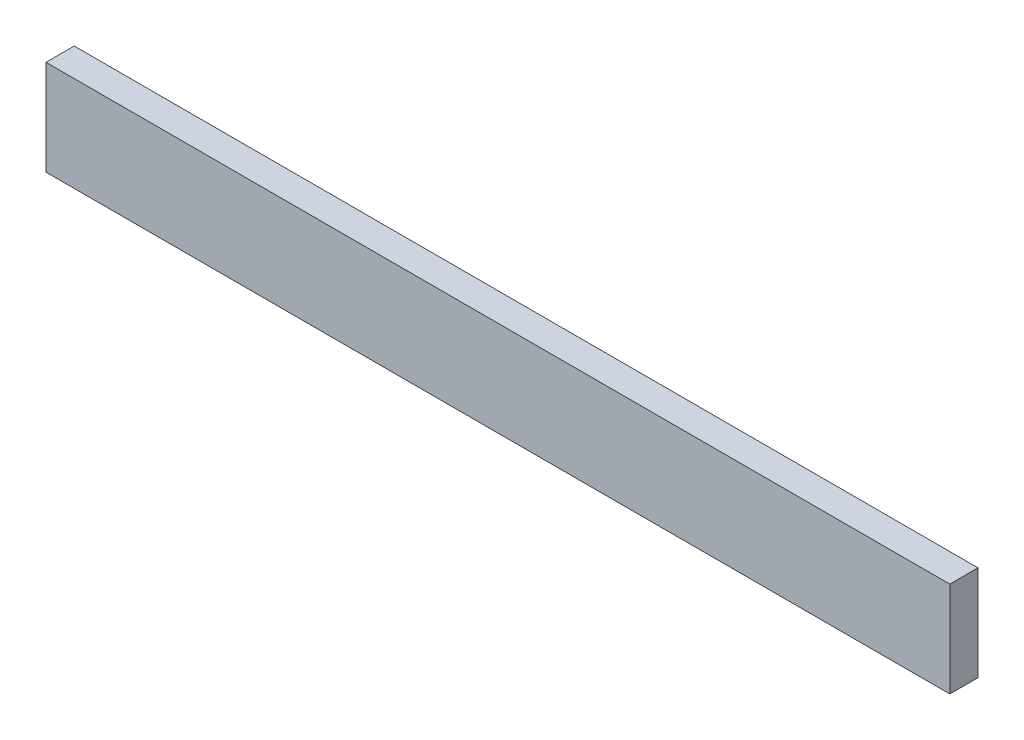
ISO-10303-21;
HEADER;
FILE_DESCRIPTION(('STEP AP214'),'2;1');
FILE_NAME('part.step','',(''),(''),'','','');
FILE_SCHEMA(('AUTOMOTIVE_DESIGN { 1 0 10303 214 1 1 1 1 }'));
ENDSEC;
DATA;
#1=APPLICATION_CONTEXT('core data for automotive mechanical design processes');
#2=APPLICATION_PROTOCOL_DEFINITION('international standard','automotive_design',2000,#1);
#3=PRODUCT_CONTEXT('',#1,'mechanical');
#4=PRODUCT('Part','Part','',(#3));
#5=PRODUCT_RELATED_PRODUCT_CATEGORY('part','',(#4));
#6=PRODUCT_DEFINITION_FORMATION('','',#4);
#7=PRODUCT_DEFINITION_CONTEXT('part definition',#1,'design');
#8=PRODUCT_DEFINITION('design','',#6,#7);
#9=PRODUCT_DEFINITION_SHAPE('','',#8);
#10=(LENGTH_UNIT() NAMED_UNIT(*) SI_UNIT(.MILLI.,.METRE.));
#11=(NAMED_UNIT(*) PLANE_ANGLE_UNIT() SI_UNIT($,.RADIAN.));
#12=(NAMED_UNIT(*) SI_UNIT($,.STERADIAN.) SOLID_ANGLE_UNIT());
#13=UNCERTAINTY_MEASURE_WITH_UNIT(LENGTH_MEASURE(1.E-05),#10,'distance_accuracy_value','');
#14=(GEOMETRIC_REPRESENTATION_CONTEXT(3) GLOBAL_UNCERTAINTY_ASSIGNED_CONTEXT((#13)) GLOBAL_UNIT_ASSIGNED_CONTEXT((#10,
#11,#12)) REPRESENTATION_CONTEXT('',''));
#15=CARTESIAN_POINT('',(0.,0.,0.));
#16=DIRECTION('',(0.,0.,1.));
#17=DIRECTION('',(1.,0.,0.));
#18=AXIS2_PLACEMENT_3D('',#15,#16,#17);
#19=CARTESIAN_POINT('',(-140.943820224719,78.5129895605844,8.));
#20=DIRECTION('',(1.,0.,0.));
#21=DIRECTION('',(0.,1.,0.));
#22=AXIS2_PLACEMENT_3D('',#19,#20,#21);
#23=PLANE('',#22);
#24=DIRECTION('',(0.,-1.,0.));
#25=VECTOR('',#24,1.);
#26=CARTESIAN_POINT('',(-140.943820224719,78.5129895605844,0.));
#27=LINE('',#26,#25);
#28=CARTESIAN_POINT('',(-140.943820224719,78.5129895605844,0.));
#29=VERTEX_POINT('',#28);
#30=CARTESIAN_POINT('',(-140.943820224719,51.5129895605844,0.));
#31=VERTEX_POINT('',#30);
#32=EDGE_CURVE('E106',#29,#31,#27,.T.);
#33=ORIENTED_EDGE('',*,*,#32,.T.);
#34=DIRECTION('',(0.,0.,-1.));
#35=VECTOR('',#34,1.);
#36=CARTESIAN_POINT('',(-140.943820224719,51.5129895605844,8.));
#37=LINE('',#36,#35);
#38=CARTESIAN_POINT('',(-140.943820224719,51.5129895605844,8.));
#39=VERTEX_POINT('',#38);
#40=EDGE_CURVE('E11',#39,#31,#37,.T.);
#41=ORIENTED_EDGE('',*,*,#40,.F.);
#42=DIRECTION('',(0.,-1.,0.));
#43=VECTOR('',#42,1.);
#44=CARTESIAN_POINT('',(-140.943820224719,78.5129895605844,8.));
#45=LINE('',#44,#43);
#46=CARTESIAN_POINT('',(-140.943820224719,78.5129895605844,8.));
#47=VERTEX_POINT('',#46);
#48=EDGE_CURVE('E94',#47,#39,#45,.T.);
#49=ORIENTED_EDGE('',*,*,#48,.F.);
#50=DIRECTION('',(0.,0.,-1.));
#51=VECTOR('',#50,1.);
#52=CARTESIAN_POINT('',(-140.943820224719,78.5129895605844,8.));
#53=LINE('',#52,#51);
#54=EDGE_CURVE('E102',#47,#29,#53,.T.);
#55=ORIENTED_EDGE('',*,*,#54,.T.);
#56=EDGE_LOOP('',(#33,#41,#49,#55));
#57=FACE_BOUND('',#56,.T.);
#58=ADVANCED_FACE('F43',(#57),#23,.F.);
#59=CARTESIAN_POINT('',(-140.943820224719,51.5129895605844,8.));
#60=DIRECTION('',(0.,1.,0.));
#61=DIRECTION('',(0.,0.,1.));
#62=AXIS2_PLACEMENT_3D('',#59,#60,#61);
#63=PLANE('',#62);
#64=DIRECTION('',(1.,0.,0.));
#65=VECTOR('',#64,1.);
#66=CARTESIAN_POINT('',(-140.943820224719,51.5129895605844,0.));
#67=LINE('',#66,#65);
#68=CARTESIAN_POINT('',(115.511519775281,51.5129895605844,0.));
#69=VERTEX_POINT('',#68);
#70=EDGE_CURVE('E98',#31,#69,#67,.T.);
#71=ORIENTED_EDGE('',*,*,#70,.T.);
#72=DIRECTION('',(0.,0.,-1.));
#73=VECTOR('',#72,1.);
#74=CARTESIAN_POINT('',(115.511519775281,51.5129895605844,8.));
#75=LINE('',#74,#73);
#76=CARTESIAN_POINT('',(115.511519775281,51.5129895605844,8.));
#77=VERTEX_POINT('',#76);
#78=EDGE_CURVE('E51',#77,#69,#75,.T.);
#79=ORIENTED_EDGE('',*,*,#78,.F.);
#80=DIRECTION('',(1.,0.,0.));
#81=VECTOR('',#80,1.);
#82=CARTESIAN_POINT('',(-140.943820224719,51.5129895605844,8.));
#83=LINE('',#82,#81);
#84=EDGE_CURVE('E89',#39,#77,#83,.T.);
#85=ORIENTED_EDGE('',*,*,#84,.F.);
#86=ORIENTED_EDGE('',*,*,#40,.T.);
#87=EDGE_LOOP('',(#71,#79,#85,#86));
#88=FACE_BOUND('',#87,.T.);
#89=ADVANCED_FACE('F97',(#88),#63,.F.);
#90=CARTESIAN_POINT('',(115.511519775281,78.5129895605844,8.));
#91=DIRECTION('',(-1.,0.,0.));
#92=DIRECTION('',(0.,0.,1.));
#93=AXIS2_PLACEMENT_3D('',#90,#91,#92);
#94=PLANE('',#93);
#95=DIRECTION('',(0.,1.,0.));
#96=VECTOR('',#95,1.);
#97=CARTESIAN_POINT('',(115.511519775281,78.5129895605844,0.));
#98=LINE('',#97,#96);
#99=CARTESIAN_POINT('',(115.511519775281,78.5129895605844,0.));
#100=VERTEX_POINT('',#99);
#101=EDGE_CURVE('E76',#69,#100,#98,.T.);
#102=ORIENTED_EDGE('',*,*,#101,.T.);
#103=DIRECTION('',(0.,0.,-1.));
#104=VECTOR('',#103,1.);
#105=CARTESIAN_POINT('',(115.511519775281,78.5129895605844,8.));
#106=LINE('',#105,#104);
#107=CARTESIAN_POINT('',(115.511519775281,78.5129895605844,8.));
#108=VERTEX_POINT('',#107);
#109=EDGE_CURVE('E99',#108,#100,#106,.T.);
#110=ORIENTED_EDGE('',*,*,#109,.F.);
#111=DIRECTION('',(0.,1.,0.));
#112=VECTOR('',#111,1.);
#113=CARTESIAN_POINT('',(115.511519775281,78.5129895605844,8.));
#114=LINE('',#113,#112);
#115=EDGE_CURVE('E92',#77,#108,#114,.T.);
#116=ORIENTED_EDGE('',*,*,#115,.F.);
#117=ORIENTED_EDGE('',*,*,#78,.T.);
#118=EDGE_LOOP('',(#102,#110,#116,#117));
#119=FACE_BOUND('',#118,.T.);
#120=ADVANCED_FACE('F100',(#119),#94,.F.);
#121=CARTESIAN_POINT('',(-140.943820224719,78.5129895605844,8.));
#122=DIRECTION('',(0.,-1.,0.));
#123=DIRECTION('',(0.,0.,-1.));
#124=AXIS2_PLACEMENT_3D('',#121,#122,#123);
#125=PLANE('',#124);
#126=DIRECTION('',(-1.,0.,0.));
#127=VECTOR('',#126,1.);
#128=CARTESIAN_POINT('',(-140.943820224719,78.5129895605844,0.));
#129=LINE('',#128,#127);
#130=EDGE_CURVE('E82',#100,#29,#129,.T.);
#131=ORIENTED_EDGE('',*,*,#130,.T.);
#132=ORIENTED_EDGE('',*,*,#54,.F.);
#133=DIRECTION('',(-1.,0.,0.));
#134=VECTOR('',#133,1.);
#135=CARTESIAN_POINT('',(-140.943820224719,78.5129895605844,8.));
#136=LINE('',#135,#134);
#137=EDGE_CURVE('E59',#108,#47,#136,.T.);
#138=ORIENTED_EDGE('',*,*,#137,.F.);
#139=ORIENTED_EDGE('',*,*,#109,.T.);
#140=EDGE_LOOP('',(#131,#132,#138,#139));
#141=FACE_BOUND('',#140,.T.);
#142=ADVANCED_FACE('F113',(#141),#125,.F.);
#143=CARTESIAN_POINT('',(0.,0.,8.));
#144=DIRECTION('',(0.,0.,1.));
#145=DIRECTION('',(1.,0.,0.));
#146=AXIS2_PLACEMENT_3D('',#143,#144,#145);
#147=PLANE('',#146);
#148=ORIENTED_EDGE('',*,*,#48,.T.);
#149=ORIENTED_EDGE('',*,*,#84,.T.);
#150=ORIENTED_EDGE('',*,*,#115,.T.);
#151=ORIENTED_EDGE('',*,*,#137,.T.);
#152=EDGE_LOOP('',(#148,#149,#150,#151));
#153=FACE_BOUND('',#152,.T.);
#154=ADVANCED_FACE('F90',(#153),#147,.T.);
#155=CARTESIAN_POINT('',(0.,0.,0.));
#156=DIRECTION('',(0.,0.,1.));
#157=DIRECTION('',(1.,0.,0.));
#158=AXIS2_PLACEMENT_3D('',#155,#156,#157);
#159=PLANE('',#158);
#160=ORIENTED_EDGE('',*,*,#32,.F.);
#161=ORIENTED_EDGE('',*,*,#130,.F.);
#162=ORIENTED_EDGE('',*,*,#101,.F.);
#163=ORIENTED_EDGE('',*,*,#70,.F.);
#164=EDGE_LOOP('',(#160,#161,#162,#163));
#165=FACE_BOUND('',#164,.T.);
#166=ADVANCED_FACE('F116',(#165),#159,.F.);
#167=CLOSED_SHELL('',(#58,#89,#120,#142,#154,#166));
#168=MANIFOLD_SOLID_BREP('B2',#167);
#169=ADVANCED_BREP_SHAPE_REPRESENTATION('',(#18,#168),#14);
#170=SHAPE_DEFINITION_REPRESENTATION(#9,#169);
ENDSEC;
END-ISO-10303-21;
